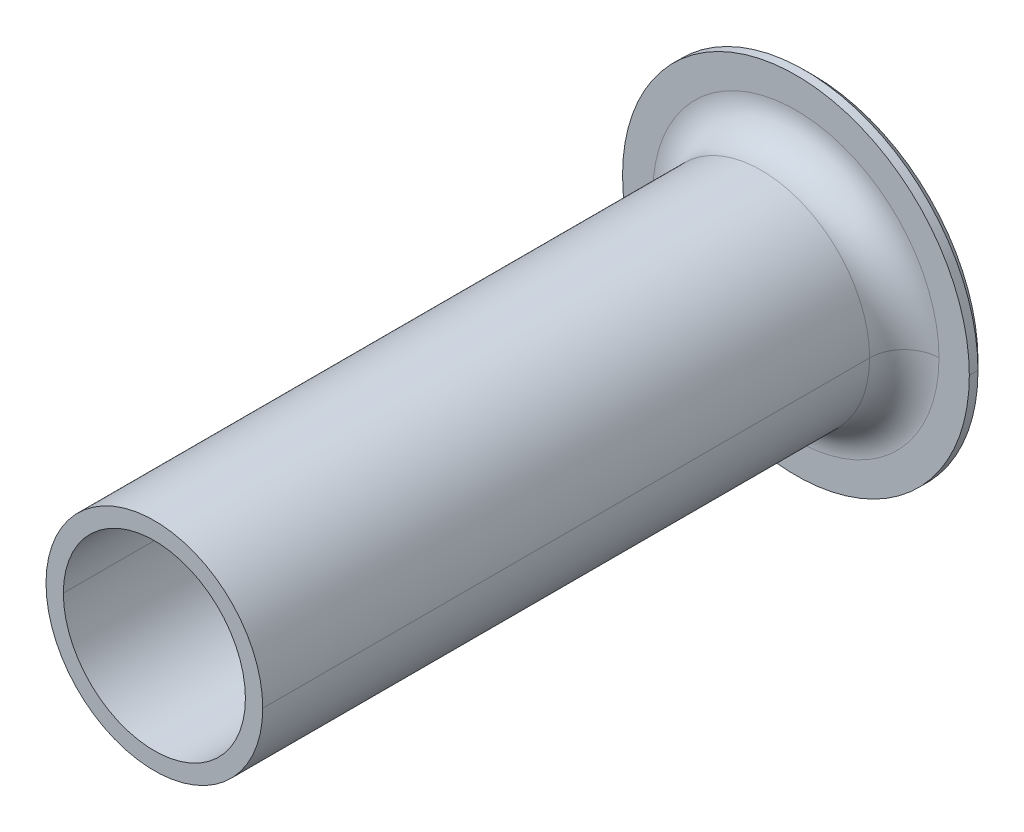
ISO-10303-21;
HEADER;
FILE_DESCRIPTION(('STEP AP214'),'2;1');
FILE_NAME('part.step','',(''),(''),'','','');
FILE_SCHEMA(('AUTOMOTIVE_DESIGN { 1 0 10303 214 1 1 1 1 }'));
ENDSEC;
DATA;
#1=APPLICATION_CONTEXT('core data for automotive mechanical design processes');
#2=APPLICATION_PROTOCOL_DEFINITION('international standard','automotive_design',2000,#1);
#3=PRODUCT_CONTEXT('',#1,'mechanical');
#4=PRODUCT('Part','Part','',(#3));
#5=PRODUCT_RELATED_PRODUCT_CATEGORY('part','',(#4));
#6=PRODUCT_DEFINITION_FORMATION('','',#4);
#7=PRODUCT_DEFINITION_CONTEXT('part definition',#1,'design');
#8=PRODUCT_DEFINITION('design','',#6,#7);
#9=PRODUCT_DEFINITION_SHAPE('','',#8);
#10=(LENGTH_UNIT() NAMED_UNIT(*) SI_UNIT(.MILLI.,.METRE.));
#11=(NAMED_UNIT(*) PLANE_ANGLE_UNIT() SI_UNIT($,.RADIAN.));
#12=(NAMED_UNIT(*) SI_UNIT($,.STERADIAN.) SOLID_ANGLE_UNIT());
#13=UNCERTAINTY_MEASURE_WITH_UNIT(LENGTH_MEASURE(1.E-05),#10,'distance_accuracy_value','');
#14=(GEOMETRIC_REPRESENTATION_CONTEXT(3) GLOBAL_UNCERTAINTY_ASSIGNED_CONTEXT((#13)) GLOBAL_UNIT_ASSIGNED_CONTEXT((#10,
#11,#12)) REPRESENTATION_CONTEXT('',''));
#15=CARTESIAN_POINT('',(0.,0.,0.));
#16=DIRECTION('',(0.,0.,1.));
#17=DIRECTION('',(1.,0.,0.));
#18=AXIS2_PLACEMENT_3D('',#15,#16,#17);
#19=CARTESIAN_POINT('',(0.,0.,-35.));
#20=DIRECTION('',(0.,0.,-1.));
#21=DIRECTION('',(-1.,0.,0.));
#22=AXIS2_PLACEMENT_3D('',#19,#20,#21);
#23=TOROIDAL_SURFACE('',#22,8.25,2.);
#24=CARTESIAN_POINT('',(0.,0.,-37.));
#25=DIRECTION('',(0.,0.,-1.));
#26=DIRECTION('',(-1.,0.,0.));
#27=AXIS2_PLACEMENT_3D('',#24,#25,#26);
#28=CIRCLE('',#27,8.25);
#29=CARTESIAN_POINT('',(8.25,0.,-37.));
#30=VERTEX_POINT('',#29);
#31=CARTESIAN_POINT('',(-8.25,0.,-37.));
#32=VERTEX_POINT('',#31);
#33=EDGE_CURVE('E41',#30,#32,#28,.T.);
#34=ORIENTED_EDGE('',*,*,#33,.F.);
#35=CARTESIAN_POINT('',(8.25,0.,-35.));
#36=DIRECTION('',(0.,1.,0.));
#37=DIRECTION('',(-1.,0.,0.));
#38=AXIS2_PLACEMENT_3D('',#35,#36,#37);
#39=CIRCLE('',#38,2.);
#40=CARTESIAN_POINT('',(6.25,0.,-35.));
#41=VERTEX_POINT('',#40);
#42=EDGE_CURVE('E11',#30,#41,#39,.T.);
#43=ORIENTED_EDGE('',*,*,#42,.T.);
#44=CARTESIAN_POINT('',(0.,0.,-35.));
#45=DIRECTION('',(0.,0.,1.));
#46=DIRECTION('',(-1.,0.,0.));
#47=AXIS2_PLACEMENT_3D('',#44,#45,#46);
#48=CIRCLE('',#47,6.25);
#49=CARTESIAN_POINT('',(-6.25,0.,-35.));
#50=VERTEX_POINT('',#49);
#51=EDGE_CURVE('E155',#50,#41,#48,.T.);
#52=ORIENTED_EDGE('',*,*,#51,.F.);
#53=CARTESIAN_POINT('',(-8.25,0.,-35.));
#54=DIRECTION('',(0.,-1.,0.));
#55=DIRECTION('',(0.,0.,-1.));
#56=AXIS2_PLACEMENT_3D('',#53,#54,#55);
#57=CIRCLE('',#56,2.);
#58=EDGE_CURVE('E124',#32,#50,#57,.T.);
#59=ORIENTED_EDGE('',*,*,#58,.F.);
#60=EDGE_LOOP('',(#34,#43,#52,#59));
#61=FACE_BOUND('',#60,.T.);
#62=ADVANCED_FACE('F16',(#61),#23,.F.);
#63=CARTESIAN_POINT('',(0.,0.,-37.5));
#64=DIRECTION('',(0.,0.,1.));
#65=DIRECTION('',(1.,0.,0.));
#66=AXIS2_PLACEMENT_3D('',#63,#64,#65);
#67=CONICAL_SURFACE('',#66,10.,0.785398163397443);
#68=CARTESIAN_POINT('',(0.,0.,-38.));
#69=DIRECTION('',(0.,0.,-1.));
#70=DIRECTION('',(1.,0.,0.));
#71=AXIS2_PLACEMENT_3D('',#68,#69,#70);
#72=CIRCLE('',#71,9.5);
#73=CARTESIAN_POINT('',(-9.5,0.,-38.));
#74=VERTEX_POINT('',#73);
#75=CARTESIAN_POINT('',(9.5,0.,-38.));
#76=VERTEX_POINT('',#75);
#77=EDGE_CURVE('E162',#74,#76,#72,.T.);
#78=ORIENTED_EDGE('',*,*,#77,.F.);
#79=DIRECTION('',(-0.707106781186544,0.,0.707106781186551));
#80=VECTOR('',#79,1.);
#81=CARTESIAN_POINT('',(-10.,0.,-37.5));
#82=LINE('',#81,#80);
#83=CARTESIAN_POINT('',(-10.,0.,-37.5));
#84=VERTEX_POINT('',#83);
#85=EDGE_CURVE('E27',#74,#84,#82,.T.);
#86=ORIENTED_EDGE('',*,*,#85,.T.);
#87=CARTESIAN_POINT('',(0.,0.,-37.5));
#88=DIRECTION('',(0.,0.,1.));
#89=DIRECTION('',(1.,0.,0.));
#90=AXIS2_PLACEMENT_3D('',#87,#88,#89);
#91=CIRCLE('',#90,10.);
#92=CARTESIAN_POINT('',(10.,0.,-37.5));
#93=VERTEX_POINT('',#92);
#94=EDGE_CURVE('E131',#93,#84,#91,.T.);
#95=ORIENTED_EDGE('',*,*,#94,.F.);
#96=DIRECTION('',(0.707106781186544,0.,0.707106781186551));
#97=VECTOR('',#96,1.);
#98=CARTESIAN_POINT('',(10.,0.,-37.5));
#99=LINE('',#98,#97);
#100=EDGE_CURVE('E112',#76,#93,#99,.T.);
#101=ORIENTED_EDGE('',*,*,#100,.F.);
#102=EDGE_LOOP('',(#78,#86,#95,#101));
#103=FACE_BOUND('',#102,.T.);
#104=ADVANCED_FACE('F137',(#103),#67,.T.);
#105=CARTESIAN_POINT('',(0.,0.,-38.));
#106=DIRECTION('',(0.,0.,-1.));
#107=DIRECTION('',(-1.,0.,0.));
#108=AXIS2_PLACEMENT_3D('',#105,#106,#107);
#109=CONICAL_SURFACE('',#108,5.75,0.785398163397446);
#110=CARTESIAN_POINT('',(0.,0.,-37.5));
#111=DIRECTION('',(0.,0.,-1.));
#112=DIRECTION('',(1.,0.,0.));
#113=AXIS2_PLACEMENT_3D('',#110,#111,#112);
#114=CIRCLE('',#113,5.25);
#115=CARTESIAN_POINT('',(5.25,0.,-37.5));
#116=VERTEX_POINT('',#115);
#117=CARTESIAN_POINT('',(-5.25,0.,-37.5));
#118=VERTEX_POINT('',#117);
#119=EDGE_CURVE('E194',#116,#118,#114,.T.);
#120=ORIENTED_EDGE('',*,*,#119,.F.);
#121=DIRECTION('',(0.707106781186546,0.,-0.707106781186549));
#122=VECTOR('',#121,1.);
#123=CARTESIAN_POINT('',(5.75,0.,-38.));
#124=LINE('',#123,#122);
#125=CARTESIAN_POINT('',(5.75,0.,-38.));
#126=VERTEX_POINT('',#125);
#127=EDGE_CURVE('E139',#116,#126,#124,.T.);
#128=ORIENTED_EDGE('',*,*,#127,.T.);
#129=CARTESIAN_POINT('',(0.,0.,-38.));
#130=DIRECTION('',(0.,0.,1.));
#131=DIRECTION('',(1.,0.,0.));
#132=AXIS2_PLACEMENT_3D('',#129,#130,#131);
#133=CIRCLE('',#132,5.75);
#134=CARTESIAN_POINT('',(-5.75,0.,-38.));
#135=VERTEX_POINT('',#134);
#136=EDGE_CURVE('E150',#135,#126,#133,.T.);
#137=ORIENTED_EDGE('',*,*,#136,.F.);
#138=DIRECTION('',(-0.707106781186546,0.,-0.707106781186549));
#139=VECTOR('',#138,1.);
#140=CARTESIAN_POINT('',(-5.75,0.,-38.));
#141=LINE('',#140,#139);
#142=EDGE_CURVE('E123',#118,#135,#141,.T.);
#143=ORIENTED_EDGE('',*,*,#142,.F.);
#144=EDGE_LOOP('',(#120,#128,#137,#143));
#145=FACE_BOUND('',#144,.T.);
#146=ADVANCED_FACE('F215',(#145),#109,.F.);
#147=CARTESIAN_POINT('',(0.,0.,0.));
#148=DIRECTION('',(0.,0.,1.));
#149=DIRECTION('',(1.,0.,0.));
#150=AXIS2_PLACEMENT_3D('',#147,#148,#149);
#151=CYLINDRICAL_SURFACE('',#150,10.);
#152=ORIENTED_EDGE('',*,*,#94,.T.);
#153=DIRECTION('',(0.,0.,1.));
#154=VECTOR('',#153,1.);
#155=CARTESIAN_POINT('',(-10.,0.,0.));
#156=LINE('',#155,#154);
#157=CARTESIAN_POINT('',(-10.,0.,-37.));
#158=VERTEX_POINT('',#157);
#159=EDGE_CURVE('E103',#84,#158,#156,.T.);
#160=ORIENTED_EDGE('',*,*,#159,.T.);
#161=CARTESIAN_POINT('',(0.,0.,-37.));
#162=DIRECTION('',(0.,0.,1.));
#163=DIRECTION('',(1.,0.,0.));
#164=AXIS2_PLACEMENT_3D('',#161,#162,#163);
#165=CIRCLE('',#164,10.);
#166=CARTESIAN_POINT('',(10.,0.,-37.));
#167=VERTEX_POINT('',#166);
#168=EDGE_CURVE('E133',#167,#158,#165,.T.);
#169=ORIENTED_EDGE('',*,*,#168,.F.);
#170=DIRECTION('',(0.,0.,1.));
#171=VECTOR('',#170,1.);
#172=CARTESIAN_POINT('',(10.,0.,0.));
#173=LINE('',#172,#171);
#174=EDGE_CURVE('E129',#93,#167,#173,.T.);
#175=ORIENTED_EDGE('',*,*,#174,.F.);
#176=EDGE_LOOP('',(#152,#160,#169,#175));
#177=FACE_BOUND('',#176,.T.);
#178=ADVANCED_FACE('F130',(#177),#151,.T.);
#179=CARTESIAN_POINT('',(0.,0.,0.));
#180=DIRECTION('',(0.,0.,1.));
#181=DIRECTION('',(1.,0.,0.));
#182=AXIS2_PLACEMENT_3D('',#179,#180,#181);
#183=CYLINDRICAL_SURFACE('',#182,5.25);
#184=ORIENTED_EDGE('',*,*,#119,.T.);
#185=DIRECTION('',(0.,0.,1.));
#186=VECTOR('',#185,1.);
#187=CARTESIAN_POINT('',(-5.25,0.,0.));
#188=LINE('',#187,#186);
#189=CARTESIAN_POINT('',(-5.25,0.,0.));
#190=VERTEX_POINT('',#189);
#191=EDGE_CURVE('E190',#118,#190,#188,.T.);
#192=ORIENTED_EDGE('',*,*,#191,.T.);
#193=CARTESIAN_POINT('',(0.,0.,0.));
#194=DIRECTION('',(0.,0.,1.));
#195=DIRECTION('',(1.,0.,0.));
#196=AXIS2_PLACEMENT_3D('',#193,#194,#195);
#197=CIRCLE('',#196,5.25);
#198=CARTESIAN_POINT('',(5.25,0.,0.));
#199=VERTEX_POINT('',#198);
#200=EDGE_CURVE('E177',#190,#199,#197,.T.);
#201=ORIENTED_EDGE('',*,*,#200,.T.);
#202=DIRECTION('',(0.,0.,1.));
#203=VECTOR('',#202,1.);
#204=CARTESIAN_POINT('',(5.25,0.,0.));
#205=LINE('',#204,#203);
#206=EDGE_CURVE('E173',#116,#199,#205,.T.);
#207=ORIENTED_EDGE('',*,*,#206,.F.);
#208=EDGE_LOOP('',(#184,#192,#201,#207));
#209=FACE_BOUND('',#208,.T.);
#210=ADVANCED_FACE('F226',(#209),#183,.F.);
#211=CARTESIAN_POINT('',(0.,0.,0.));
#212=DIRECTION('',(0.,0.,1.));
#213=DIRECTION('',(1.,0.,0.));
#214=AXIS2_PLACEMENT_3D('',#211,#212,#213);
#215=CYLINDRICAL_SURFACE('',#214,6.25);
#216=CARTESIAN_POINT('',(0.,0.,-35.));
#217=DIRECTION('',(0.,0.,1.));
#218=DIRECTION('',(-1.,0.,0.));
#219=AXIS2_PLACEMENT_3D('',#216,#217,#218);
#220=CIRCLE('',#219,6.25);
#221=EDGE_CURVE('E167',#41,#50,#220,.T.);
#222=ORIENTED_EDGE('',*,*,#221,.T.);
#223=DIRECTION('',(0.,0.,1.));
#224=VECTOR('',#223,1.);
#225=CARTESIAN_POINT('',(-6.25,0.,0.));
#226=LINE('',#225,#224);
#227=CARTESIAN_POINT('',(-6.25,0.,0.));
#228=VERTEX_POINT('',#227);
#229=EDGE_CURVE('E157',#50,#228,#226,.T.);
#230=ORIENTED_EDGE('',*,*,#229,.T.);
#231=CARTESIAN_POINT('',(0.,0.,0.));
#232=DIRECTION('',(0.,0.,1.));
#233=DIRECTION('',(1.,0.,0.));
#234=AXIS2_PLACEMENT_3D('',#231,#232,#233);
#235=CIRCLE('',#234,6.25);
#236=CARTESIAN_POINT('',(6.25,0.,0.));
#237=VERTEX_POINT('',#236);
#238=EDGE_CURVE('E198',#237,#228,#235,.T.);
#239=ORIENTED_EDGE('',*,*,#238,.F.);
#240=DIRECTION('',(0.,0.,1.));
#241=VECTOR('',#240,1.);
#242=CARTESIAN_POINT('',(6.25,0.,0.));
#243=LINE('',#242,#241);
#244=EDGE_CURVE('E158',#41,#237,#243,.T.);
#245=ORIENTED_EDGE('',*,*,#244,.F.);
#246=EDGE_LOOP('',(#222,#230,#239,#245));
#247=FACE_BOUND('',#246,.T.);
#248=ADVANCED_FACE('F259',(#247),#215,.T.);
#249=CARTESIAN_POINT('',(0.,0.,0.));
#250=DIRECTION('',(0.,0.,1.));
#251=DIRECTION('',(1.,0.,0.));
#252=AXIS2_PLACEMENT_3D('',#249,#250,#251);
#253=CYLINDRICAL_SURFACE('',#252,6.25);
#254=ORIENTED_EDGE('',*,*,#229,.F.);
#255=ORIENTED_EDGE('',*,*,#51,.T.);
#256=ORIENTED_EDGE('',*,*,#244,.T.);
#257=CARTESIAN_POINT('',(0.,0.,0.));
#258=DIRECTION('',(0.,0.,1.));
#259=DIRECTION('',(1.,0.,0.));
#260=AXIS2_PLACEMENT_3D('',#257,#258,#259);
#261=CIRCLE('',#260,6.25);
#262=EDGE_CURVE('E172',#228,#237,#261,.T.);
#263=ORIENTED_EDGE('',*,*,#262,.F.);
#264=EDGE_LOOP('',(#254,#255,#256,#263));
#265=FACE_BOUND('',#264,.T.);
#266=ADVANCED_FACE('F262',(#265),#253,.T.);
#267=CARTESIAN_POINT('',(0.,6.25,0.));
#268=DIRECTION('',(0.,0.,-1.));
#269=DIRECTION('',(0.,-1.,0.));
#270=AXIS2_PLACEMENT_3D('',#267,#268,#269);
#271=PLANE('',#270);
#272=ORIENTED_EDGE('',*,*,#238,.T.);
#273=ORIENTED_EDGE('',*,*,#262,.T.);
#274=EDGE_LOOP('',(#272,#273));
#275=FACE_BOUND('',#274,.T.);
#276=CARTESIAN_POINT('',(0.,0.,0.));
#277=DIRECTION('',(0.,0.,1.));
#278=DIRECTION('',(1.,0.,0.));
#279=AXIS2_PLACEMENT_3D('',#276,#277,#278);
#280=CIRCLE('',#279,5.25);
#281=EDGE_CURVE('E153',#199,#190,#280,.T.);
#282=ORIENTED_EDGE('',*,*,#281,.F.);
#283=ORIENTED_EDGE('',*,*,#200,.F.);
#284=EDGE_LOOP('',(#282,#283));
#285=FACE_BOUND('',#284,.T.);
#286=ADVANCED_FACE('F251',(#275,#285),#271,.F.);
#287=CARTESIAN_POINT('',(0.,0.,0.));
#288=DIRECTION('',(0.,0.,1.));
#289=DIRECTION('',(1.,0.,0.));
#290=AXIS2_PLACEMENT_3D('',#287,#288,#289);
#291=CYLINDRICAL_SURFACE('',#290,5.25);
#292=ORIENTED_EDGE('',*,*,#191,.F.);
#293=CARTESIAN_POINT('',(0.,0.,-37.5));
#294=DIRECTION('',(0.,0.,-1.));
#295=DIRECTION('',(1.,0.,0.));
#296=AXIS2_PLACEMENT_3D('',#293,#294,#295);
#297=CIRCLE('',#296,5.25);
#298=EDGE_CURVE('E168',#118,#116,#297,.T.);
#299=ORIENTED_EDGE('',*,*,#298,.T.);
#300=ORIENTED_EDGE('',*,*,#206,.T.);
#301=ORIENTED_EDGE('',*,*,#281,.T.);
#302=EDGE_LOOP('',(#292,#299,#300,#301));
#303=FACE_BOUND('',#302,.T.);
#304=ADVANCED_FACE('F208',(#303),#291,.F.);
#305=CARTESIAN_POINT('',(0.,10.,-38.));
#306=DIRECTION('',(0.,0.,1.));
#307=DIRECTION('',(1.,0.,0.));
#308=AXIS2_PLACEMENT_3D('',#305,#306,#307);
#309=PLANE('',#308);
#310=CARTESIAN_POINT('',(0.,0.,-38.));
#311=DIRECTION('',(0.,0.,-1.));
#312=DIRECTION('',(1.,0.,0.));
#313=AXIS2_PLACEMENT_3D('',#310,#311,#312);
#314=CIRCLE('',#313,9.5);
#315=EDGE_CURVE('E118',#76,#74,#314,.T.);
#316=ORIENTED_EDGE('',*,*,#315,.T.);
#317=ORIENTED_EDGE('',*,*,#77,.T.);
#318=EDGE_LOOP('',(#316,#317));
#319=FACE_BOUND('',#318,.T.);
#320=ORIENTED_EDGE('',*,*,#136,.T.);
#321=CARTESIAN_POINT('',(0.,0.,-38.));
#322=DIRECTION('',(0.,0.,1.));
#323=DIRECTION('',(1.,0.,0.));
#324=AXIS2_PLACEMENT_3D('',#321,#322,#323);
#325=CIRCLE('',#324,5.75);
#326=EDGE_CURVE('E20',#126,#135,#325,.T.);
#327=ORIENTED_EDGE('',*,*,#326,.T.);
#328=EDGE_LOOP('',(#320,#327));
#329=FACE_BOUND('',#328,.T.);
#330=ADVANCED_FACE('F205',(#319,#329),#309,.F.);
#331=CARTESIAN_POINT('',(0.,0.,0.));
#332=DIRECTION('',(0.,0.,1.));
#333=DIRECTION('',(1.,0.,0.));
#334=AXIS2_PLACEMENT_3D('',#331,#332,#333);
#335=CYLINDRICAL_SURFACE('',#334,10.);
#336=ORIENTED_EDGE('',*,*,#159,.F.);
#337=CARTESIAN_POINT('',(0.,0.,-37.5));
#338=DIRECTION('',(0.,0.,1.));
#339=DIRECTION('',(1.,0.,0.));
#340=AXIS2_PLACEMENT_3D('',#337,#338,#339);
#341=CIRCLE('',#340,10.);
#342=EDGE_CURVE('E116',#84,#93,#341,.T.);
#343=ORIENTED_EDGE('',*,*,#342,.T.);
#344=ORIENTED_EDGE('',*,*,#174,.T.);
#345=CARTESIAN_POINT('',(0.,0.,-37.));
#346=DIRECTION('',(0.,0.,1.));
#347=DIRECTION('',(1.,0.,0.));
#348=AXIS2_PLACEMENT_3D('',#345,#346,#347);
#349=CIRCLE('',#348,10.);
#350=EDGE_CURVE('E183',#158,#167,#349,.T.);
#351=ORIENTED_EDGE('',*,*,#350,.F.);
#352=EDGE_LOOP('',(#336,#343,#344,#351));
#353=FACE_BOUND('',#352,.T.);
#354=ADVANCED_FACE('F141',(#353),#335,.T.);
#355=CARTESIAN_POINT('',(0.,6.25,-37.));
#356=DIRECTION('',(0.,0.,-1.));
#357=DIRECTION('',(0.,-1.,0.));
#358=AXIS2_PLACEMENT_3D('',#355,#356,#357);
#359=PLANE('',#358);
#360=ORIENTED_EDGE('',*,*,#168,.T.);
#361=ORIENTED_EDGE('',*,*,#350,.T.);
#362=EDGE_LOOP('',(#360,#361));
#363=FACE_BOUND('',#362,.T.);
#364=CARTESIAN_POINT('',(0.,0.,-37.));
#365=DIRECTION('',(0.,0.,-1.));
#366=DIRECTION('',(-1.,0.,0.));
#367=AXIS2_PLACEMENT_3D('',#364,#365,#366);
#368=CIRCLE('',#367,8.25);
#369=EDGE_CURVE('E235',#32,#30,#368,.T.);
#370=ORIENTED_EDGE('',*,*,#369,.T.);
#371=ORIENTED_EDGE('',*,*,#33,.T.);
#372=EDGE_LOOP('',(#370,#371));
#373=FACE_BOUND('',#372,.T.);
#374=ADVANCED_FACE('F278',(#363,#373),#359,.F.);
#375=CARTESIAN_POINT('',(0.,0.,-38.));
#376=DIRECTION('',(0.,0.,-1.));
#377=DIRECTION('',(-1.,0.,0.));
#378=AXIS2_PLACEMENT_3D('',#375,#376,#377);
#379=CONICAL_SURFACE('',#378,5.75,0.785398163397446);
#380=ORIENTED_EDGE('',*,*,#127,.F.);
#381=ORIENTED_EDGE('',*,*,#298,.F.);
#382=ORIENTED_EDGE('',*,*,#142,.T.);
#383=ORIENTED_EDGE('',*,*,#326,.F.);
#384=EDGE_LOOP('',(#380,#381,#382,#383));
#385=FACE_BOUND('',#384,.T.);
#386=ADVANCED_FACE('F219',(#385),#379,.F.);
#387=CARTESIAN_POINT('',(0.,0.,-37.5));
#388=DIRECTION('',(0.,0.,1.));
#389=DIRECTION('',(1.,0.,0.));
#390=AXIS2_PLACEMENT_3D('',#387,#388,#389);
#391=CONICAL_SURFACE('',#390,10.,0.785398163397443);
#392=ORIENTED_EDGE('',*,*,#85,.F.);
#393=ORIENTED_EDGE('',*,*,#315,.F.);
#394=ORIENTED_EDGE('',*,*,#100,.T.);
#395=ORIENTED_EDGE('',*,*,#342,.F.);
#396=EDGE_LOOP('',(#392,#393,#394,#395));
#397=FACE_BOUND('',#396,.T.);
#398=ADVANCED_FACE('F115',(#397),#391,.T.);
#399=CARTESIAN_POINT('',(0.,0.,-35.));
#400=DIRECTION('',(0.,0.,-1.));
#401=DIRECTION('',(-1.,0.,0.));
#402=AXIS2_PLACEMENT_3D('',#399,#400,#401);
#403=TOROIDAL_SURFACE('',#402,8.25,2.);
#404=ORIENTED_EDGE('',*,*,#42,.F.);
#405=ORIENTED_EDGE('',*,*,#369,.F.);
#406=ORIENTED_EDGE('',*,*,#58,.T.);
#407=ORIENTED_EDGE('',*,*,#221,.F.);
#408=EDGE_LOOP('',(#404,#405,#406,#407));
#409=FACE_BOUND('',#408,.T.);
#410=ADVANCED_FACE('F18',(#409),#403,.F.);
#411=CLOSED_SHELL('',(#62,#104,#146,#178,#210,#248,#266,#286,#304,#330,#354,#374,#386,#398,#410));
#412=MANIFOLD_SOLID_BREP('B1',#411);
#413=ADVANCED_BREP_SHAPE_REPRESENTATION('',(#18,#412),#14);
#414=SHAPE_DEFINITION_REPRESENTATION(#9,#413);
ENDSEC;
END-ISO-10303-21;
